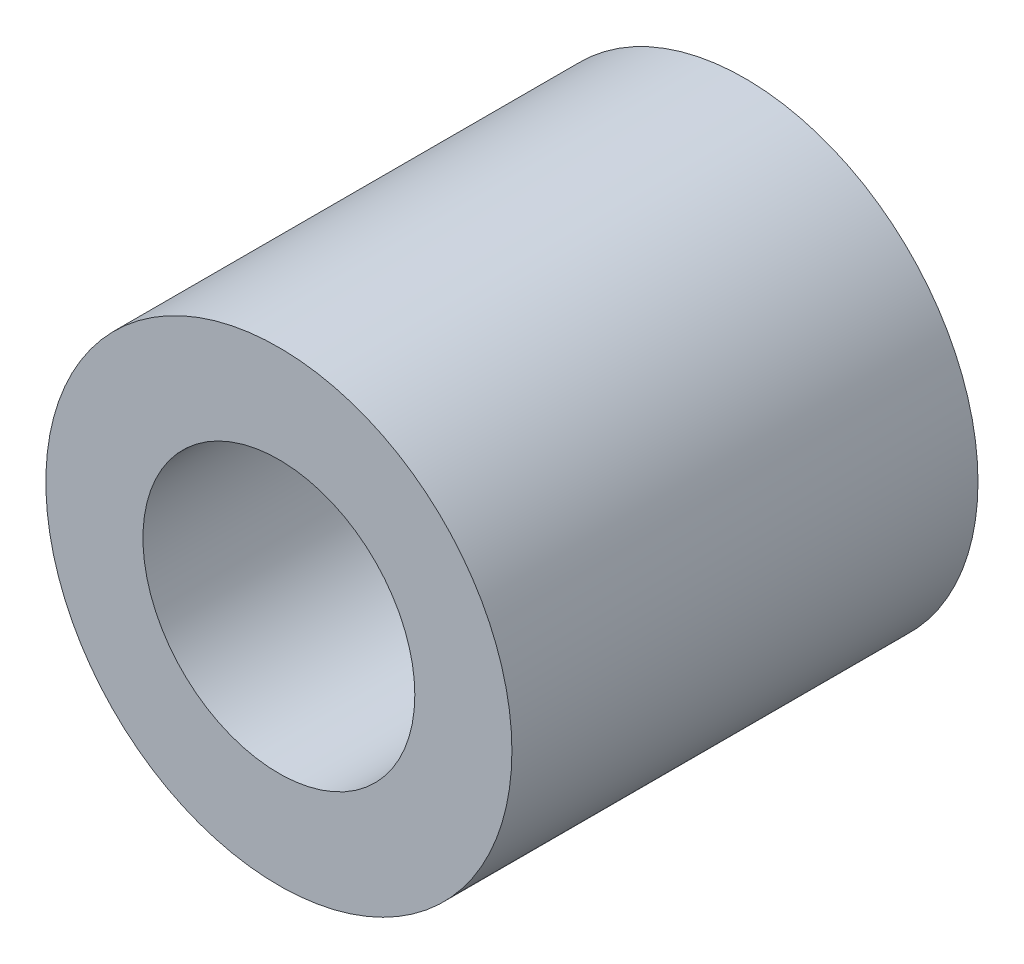
ISO-10303-21;
HEADER;
FILE_DESCRIPTION(('STEP AP214'),'2;1');
FILE_NAME('part.step','',(''),(''),'','','');
FILE_SCHEMA(('AUTOMOTIVE_DESIGN { 1 0 10303 214 1 1 1 1 }'));
ENDSEC;
DATA;
#1=APPLICATION_CONTEXT('core data for automotive mechanical design processes');
#2=APPLICATION_PROTOCOL_DEFINITION('international standard','automotive_design',2000,#1);
#3=PRODUCT_CONTEXT('',#1,'mechanical');
#4=PRODUCT('Part','Part','',(#3));
#5=PRODUCT_RELATED_PRODUCT_CATEGORY('part','',(#4));
#6=PRODUCT_DEFINITION_FORMATION('','',#4);
#7=PRODUCT_DEFINITION_CONTEXT('part definition',#1,'design');
#8=PRODUCT_DEFINITION('design','',#6,#7);
#9=PRODUCT_DEFINITION_SHAPE('','',#8);
#10=(LENGTH_UNIT() NAMED_UNIT(*) SI_UNIT(.MILLI.,.METRE.));
#11=(NAMED_UNIT(*) PLANE_ANGLE_UNIT() SI_UNIT($,.RADIAN.));
#12=(NAMED_UNIT(*) SI_UNIT($,.STERADIAN.) SOLID_ANGLE_UNIT());
#13=UNCERTAINTY_MEASURE_WITH_UNIT(LENGTH_MEASURE(1.E-05),#10,'distance_accuracy_value','');
#14=(GEOMETRIC_REPRESENTATION_CONTEXT(3) GLOBAL_UNCERTAINTY_ASSIGNED_CONTEXT((#13)) GLOBAL_UNIT_ASSIGNED_CONTEXT((#10,
#11,#12)) REPRESENTATION_CONTEXT('',''));
#15=CARTESIAN_POINT('',(0.,0.,0.));
#16=DIRECTION('',(0.,0.,1.));
#17=DIRECTION('',(1.,0.,0.));
#18=AXIS2_PLACEMENT_3D('',#15,#16,#17);
#19=CARTESIAN_POINT('',(0.,0.,12.));
#20=DIRECTION('',(0.,0.,1.));
#21=DIRECTION('',(1.,0.,0.));
#22=AXIS2_PLACEMENT_3D('',#19,#20,#21);
#23=PLANE('',#22);
#24=CARTESIAN_POINT('',(0.,0.,12.));
#25=DIRECTION('',(0.,0.,1.));
#26=DIRECTION('',(1.,0.,0.));
#27=AXIS2_PLACEMENT_3D('',#24,#25,#26);
#28=CIRCLE('',#27,6.);
#29=CARTESIAN_POINT('',(6.,0.,12.));
#30=VERTEX_POINT('',#29);
#31=EDGE_CURVE('E10',#30,#30,#28,.T.);
#32=ORIENTED_EDGE('',*,*,#31,.T.);
#33=EDGE_LOOP('',(#32));
#34=FACE_BOUND('',#33,.T.);
#35=CARTESIAN_POINT('',(0.,0.,12.));
#36=DIRECTION('',(0.,0.,1.));
#37=DIRECTION('',(1.,0.,0.));
#38=AXIS2_PLACEMENT_3D('',#35,#36,#37);
#39=CIRCLE('',#38,3.5);
#40=CARTESIAN_POINT('',(3.5,0.,12.));
#41=VERTEX_POINT('',#40);
#42=EDGE_CURVE('E50',#41,#41,#39,.T.);
#43=ORIENTED_EDGE('',*,*,#42,.F.);
#44=EDGE_LOOP('',(#43));
#45=FACE_BOUND('',#44,.T.);
#46=ADVANCED_FACE('F37',(#34,#45),#23,.T.);
#47=CARTESIAN_POINT('',(0.,0.,0.));
#48=DIRECTION('',(0.,0.,1.));
#49=DIRECTION('',(1.,0.,0.));
#50=AXIS2_PLACEMENT_3D('',#47,#48,#49);
#51=PLANE('',#50);
#52=CARTESIAN_POINT('',(0.,0.,0.));
#53=DIRECTION('',(0.,0.,1.));
#54=DIRECTION('',(1.,0.,0.));
#55=AXIS2_PLACEMENT_3D('',#52,#53,#54);
#56=CIRCLE('',#55,6.);
#57=CARTESIAN_POINT('',(6.,0.,0.));
#58=VERTEX_POINT('',#57);
#59=EDGE_CURVE('E41',#58,#58,#56,.T.);
#60=ORIENTED_EDGE('',*,*,#59,.F.);
#61=EDGE_LOOP('',(#60));
#62=FACE_BOUND('',#61,.T.);
#63=CARTESIAN_POINT('',(0.,0.,0.));
#64=DIRECTION('',(0.,0.,1.));
#65=DIRECTION('',(1.,0.,0.));
#66=AXIS2_PLACEMENT_3D('',#63,#64,#65);
#67=CIRCLE('',#66,3.5);
#68=CARTESIAN_POINT('',(3.5,0.,0.));
#69=VERTEX_POINT('',#68);
#70=EDGE_CURVE('E52',#69,#69,#67,.T.);
#71=ORIENTED_EDGE('',*,*,#70,.T.);
#72=EDGE_LOOP('',(#71));
#73=FACE_BOUND('',#72,.T.);
#74=ADVANCED_FACE('F64',(#62,#73),#51,.F.);
#75=CARTESIAN_POINT('',(0.,0.,12.));
#76=DIRECTION('',(0.,0.,-1.));
#77=DIRECTION('',(-1.,0.,0.));
#78=AXIS2_PLACEMENT_3D('',#75,#76,#77);
#79=CYLINDRICAL_SURFACE('',#78,6.);
#80=ORIENTED_EDGE('',*,*,#31,.F.);
#81=EDGE_LOOP('',(#80));
#82=FACE_BOUND('',#81,.T.);
#83=ORIENTED_EDGE('',*,*,#59,.T.);
#84=EDGE_LOOP('',(#83));
#85=FACE_BOUND('',#84,.T.);
#86=ADVANCED_FACE('F39',(#82,#85),#79,.T.);
#87=CARTESIAN_POINT('',(0.,0.,12.));
#88=DIRECTION('',(0.,0.,-1.));
#89=DIRECTION('',(-1.,0.,0.));
#90=AXIS2_PLACEMENT_3D('',#87,#88,#89);
#91=CYLINDRICAL_SURFACE('',#90,3.5);
#92=ORIENTED_EDGE('',*,*,#42,.T.);
#93=EDGE_LOOP('',(#92));
#94=FACE_BOUND('',#93,.T.);
#95=ORIENTED_EDGE('',*,*,#70,.F.);
#96=EDGE_LOOP('',(#95));
#97=FACE_BOUND('',#96,.T.);
#98=ADVANCED_FACE('F60',(#94,#97),#91,.F.);
#99=CLOSED_SHELL('',(#46,#74,#86,#98));
#100=MANIFOLD_SOLID_BREP('B2',#99);
#101=ADVANCED_BREP_SHAPE_REPRESENTATION('',(#18,#100),#14);
#102=SHAPE_DEFINITION_REPRESENTATION(#9,#101);
ENDSEC;
END-ISO-10303-21;
